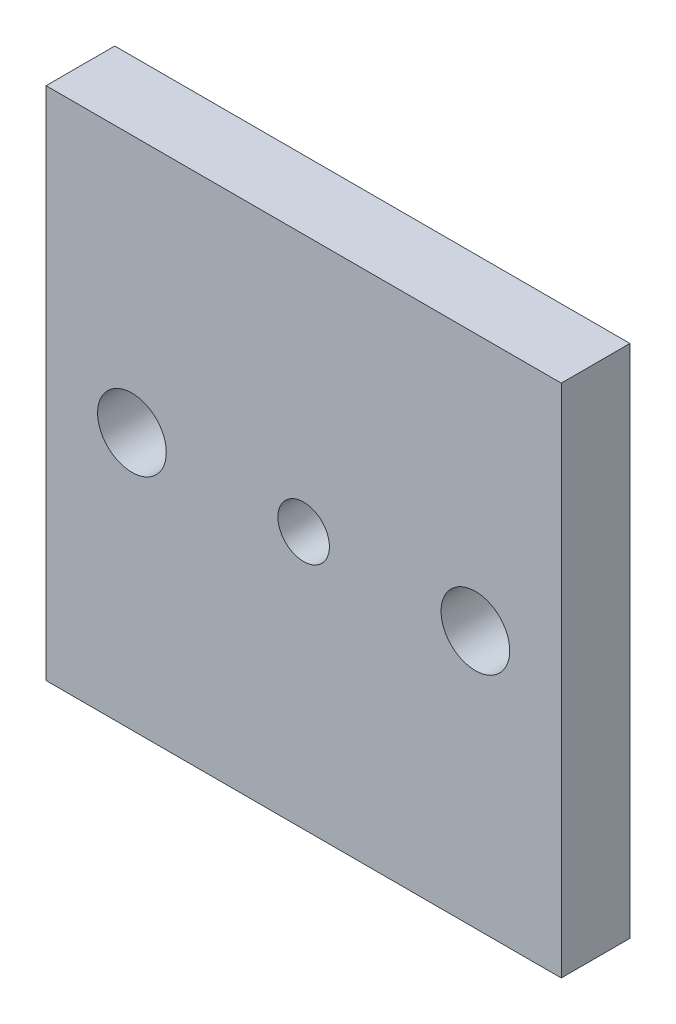
ISO-10303-21;
HEADER;
FILE_DESCRIPTION(('STEP AP214'),'2;1');
FILE_NAME('part.step','',(''),(''),'','','');
FILE_SCHEMA(('AUTOMOTIVE_DESIGN { 1 0 10303 214 1 1 1 1 }'));
ENDSEC;
DATA;
#1=APPLICATION_CONTEXT('core data for automotive mechanical design processes');
#2=APPLICATION_PROTOCOL_DEFINITION('international standard','automotive_design',2000,#1);
#3=PRODUCT_CONTEXT('',#1,'mechanical');
#4=PRODUCT('Part','Part','',(#3));
#5=PRODUCT_RELATED_PRODUCT_CATEGORY('part','',(#4));
#6=PRODUCT_DEFINITION_FORMATION('','',#4);
#7=PRODUCT_DEFINITION_CONTEXT('part definition',#1,'design');
#8=PRODUCT_DEFINITION('design','',#6,#7);
#9=PRODUCT_DEFINITION_SHAPE('','',#8);
#10=(LENGTH_UNIT() NAMED_UNIT(*) SI_UNIT(.MILLI.,.METRE.));
#11=(NAMED_UNIT(*) PLANE_ANGLE_UNIT() SI_UNIT($,.RADIAN.));
#12=(NAMED_UNIT(*) SI_UNIT($,.STERADIAN.) SOLID_ANGLE_UNIT());
#13=UNCERTAINTY_MEASURE_WITH_UNIT(LENGTH_MEASURE(1.E-05),#10,'distance_accuracy_value','');
#14=(GEOMETRIC_REPRESENTATION_CONTEXT(3) GLOBAL_UNCERTAINTY_ASSIGNED_CONTEXT((#13)) GLOBAL_UNIT_ASSIGNED_CONTEXT((#10,
#11,#12)) REPRESENTATION_CONTEXT('',''));
#15=CARTESIAN_POINT('',(0.,0.,0.));
#16=DIRECTION('',(0.,0.,1.));
#17=DIRECTION('',(1.,0.,0.));
#18=AXIS2_PLACEMENT_3D('',#15,#16,#17);
#19=CARTESIAN_POINT('',(0.,0.,4.));
#20=DIRECTION('',(1.,0.,0.));
#21=DIRECTION('',(0.,1.,0.));
#22=AXIS2_PLACEMENT_3D('',#19,#20,#21);
#23=PLANE('',#22);
#24=DIRECTION('',(0.,-1.,0.));
#25=VECTOR('',#24,1.);
#26=CARTESIAN_POINT('',(0.,0.,0.));
#27=LINE('',#26,#25);
#28=CARTESIAN_POINT('',(0.,0.,0.));
#29=VERTEX_POINT('',#28);
#30=CARTESIAN_POINT('',(0.,-30.,0.));
#31=VERTEX_POINT('',#30);
#32=EDGE_CURVE('E112',#29,#31,#27,.T.);
#33=ORIENTED_EDGE('',*,*,#32,.T.);
#34=DIRECTION('',(0.,0.,-1.));
#35=VECTOR('',#34,1.);
#36=CARTESIAN_POINT('',(0.,-30.,4.));
#37=LINE('',#36,#35);
#38=CARTESIAN_POINT('',(0.,-30.,4.));
#39=VERTEX_POINT('',#38);
#40=EDGE_CURVE('E11',#39,#31,#37,.T.);
#41=ORIENTED_EDGE('',*,*,#40,.F.);
#42=DIRECTION('',(0.,-1.,0.));
#43=VECTOR('',#42,1.);
#44=CARTESIAN_POINT('',(0.,0.,4.));
#45=LINE('',#44,#43);
#46=CARTESIAN_POINT('',(0.,0.,4.));
#47=VERTEX_POINT('',#46);
#48=EDGE_CURVE('E89',#47,#39,#45,.T.);
#49=ORIENTED_EDGE('',*,*,#48,.F.);
#50=DIRECTION('',(0.,0.,-1.));
#51=VECTOR('',#50,1.);
#52=CARTESIAN_POINT('',(0.,0.,4.));
#53=LINE('',#52,#51);
#54=EDGE_CURVE('E56',#47,#29,#53,.T.);
#55=ORIENTED_EDGE('',*,*,#54,.T.);
#56=EDGE_LOOP('',(#33,#41,#49,#55));
#57=FACE_BOUND('',#56,.T.);
#58=ADVANCED_FACE('F39',(#57),#23,.F.);
#59=CARTESIAN_POINT('',(0.,-30.,4.));
#60=DIRECTION('',(0.,1.,0.));
#61=DIRECTION('',(0.,0.,1.));
#62=AXIS2_PLACEMENT_3D('',#59,#60,#61);
#63=PLANE('',#62);
#64=DIRECTION('',(1.,0.,0.));
#65=VECTOR('',#64,1.);
#66=CARTESIAN_POINT('',(0.,-30.,0.));
#67=LINE('',#66,#65);
#68=CARTESIAN_POINT('',(30.,-30.,0.));
#69=VERTEX_POINT('',#68);
#70=EDGE_CURVE('E94',#31,#69,#67,.T.);
#71=ORIENTED_EDGE('',*,*,#70,.T.);
#72=DIRECTION('',(0.,0.,-1.));
#73=VECTOR('',#72,1.);
#74=CARTESIAN_POINT('',(30.,-30.,4.));
#75=LINE('',#74,#73);
#76=CARTESIAN_POINT('',(30.,-30.,4.));
#77=VERTEX_POINT('',#76);
#78=EDGE_CURVE('E48',#77,#69,#75,.T.);
#79=ORIENTED_EDGE('',*,*,#78,.F.);
#80=DIRECTION('',(1.,0.,0.));
#81=VECTOR('',#80,1.);
#82=CARTESIAN_POINT('',(0.,-30.,4.));
#83=LINE('',#82,#81);
#84=EDGE_CURVE('E81',#39,#77,#83,.T.);
#85=ORIENTED_EDGE('',*,*,#84,.F.);
#86=ORIENTED_EDGE('',*,*,#40,.T.);
#87=EDGE_LOOP('',(#71,#79,#85,#86));
#88=FACE_BOUND('',#87,.T.);
#89=ADVANCED_FACE('F93',(#88),#63,.F.);
#90=CARTESIAN_POINT('',(30.,0.,4.));
#91=DIRECTION('',(1.,0.,0.));
#92=DIRECTION('',(0.,0.,-1.));
#93=AXIS2_PLACEMENT_3D('',#90,#91,#92);
#94=PLANE('',#93);
#95=DIRECTION('',(0.,-1.,0.));
#96=VECTOR('',#95,1.);
#97=CARTESIAN_POINT('',(30.,0.,0.));
#98=LINE('',#97,#96);
#99=CARTESIAN_POINT('',(30.,0.,0.));
#100=VERTEX_POINT('',#99);
#101=EDGE_CURVE('E115',#100,#69,#98,.T.);
#102=ORIENTED_EDGE('',*,*,#101,.F.);
#103=DIRECTION('',(0.,0.,-1.));
#104=VECTOR('',#103,1.);
#105=CARTESIAN_POINT('',(30.,0.,4.));
#106=LINE('',#105,#104);
#107=CARTESIAN_POINT('',(30.,0.,4.));
#108=VERTEX_POINT('',#107);
#109=EDGE_CURVE('E70',#108,#100,#106,.T.);
#110=ORIENTED_EDGE('',*,*,#109,.F.);
#111=DIRECTION('',(0.,-1.,0.));
#112=VECTOR('',#111,1.);
#113=CARTESIAN_POINT('',(30.,0.,4.));
#114=LINE('',#113,#112);
#115=EDGE_CURVE('E88',#108,#77,#114,.T.);
#116=ORIENTED_EDGE('',*,*,#115,.T.);
#117=ORIENTED_EDGE('',*,*,#78,.T.);
#118=EDGE_LOOP('',(#102,#110,#116,#117));
#119=FACE_BOUND('',#118,.T.);
#120=ADVANCED_FACE('F97',(#119),#94,.T.);
#121=CARTESIAN_POINT('',(25.,-15.,4.));
#122=DIRECTION('',(0.,0.,-1.));
#123=DIRECTION('',(-1.,0.,0.));
#124=AXIS2_PLACEMENT_3D('',#121,#122,#123);
#125=CYLINDRICAL_SURFACE('',#124,2.);
#126=CARTESIAN_POINT('',(25.,-15.,4.));
#127=DIRECTION('',(0.,0.,1.));
#128=DIRECTION('',(1.,0.,0.));
#129=AXIS2_PLACEMENT_3D('',#126,#127,#128);
#130=CIRCLE('',#129,2.);
#131=CARTESIAN_POINT('',(27.,-15.,4.));
#132=VERTEX_POINT('',#131);
#133=EDGE_CURVE('E129',#132,#132,#130,.T.);
#134=ORIENTED_EDGE('',*,*,#133,.T.);
#135=EDGE_LOOP('',(#134));
#136=FACE_BOUND('',#135,.T.);
#137=CARTESIAN_POINT('',(25.,-15.,0.));
#138=DIRECTION('',(0.,0.,1.));
#139=DIRECTION('',(1.,0.,0.));
#140=AXIS2_PLACEMENT_3D('',#137,#138,#139);
#141=CIRCLE('',#140,2.);
#142=CARTESIAN_POINT('',(27.,-15.,0.));
#143=VERTEX_POINT('',#142);
#144=EDGE_CURVE('E109',#143,#143,#141,.T.);
#145=ORIENTED_EDGE('',*,*,#144,.F.);
#146=EDGE_LOOP('',(#145));
#147=FACE_BOUND('',#146,.T.);
#148=ADVANCED_FACE('F135',(#136,#147),#125,.F.);
#149=CARTESIAN_POINT('',(15.,-15.,4.));
#150=DIRECTION('',(0.,0.,-1.));
#151=DIRECTION('',(-1.,0.,0.));
#152=AXIS2_PLACEMENT_3D('',#149,#150,#151);
#153=CYLINDRICAL_SURFACE('',#152,1.5);
#154=CARTESIAN_POINT('',(15.,-15.,4.));
#155=DIRECTION('',(0.,0.,1.));
#156=DIRECTION('',(1.,0.,0.));
#157=AXIS2_PLACEMENT_3D('',#154,#155,#156);
#158=CIRCLE('',#157,1.5);
#159=CARTESIAN_POINT('',(16.5,-15.,4.));
#160=VERTEX_POINT('',#159);
#161=EDGE_CURVE('E124',#160,#160,#158,.T.);
#162=ORIENTED_EDGE('',*,*,#161,.T.);
#163=EDGE_LOOP('',(#162));
#164=FACE_BOUND('',#163,.T.);
#165=CARTESIAN_POINT('',(15.,-15.,0.));
#166=DIRECTION('',(0.,0.,1.));
#167=DIRECTION('',(1.,0.,0.));
#168=AXIS2_PLACEMENT_3D('',#165,#166,#167);
#169=CIRCLE('',#168,1.5);
#170=CARTESIAN_POINT('',(16.5,-15.,0.));
#171=VERTEX_POINT('',#170);
#172=EDGE_CURVE('E106',#171,#171,#169,.T.);
#173=ORIENTED_EDGE('',*,*,#172,.F.);
#174=EDGE_LOOP('',(#173));
#175=FACE_BOUND('',#174,.T.);
#176=ADVANCED_FACE('F160',(#164,#175),#153,.F.);
#177=CARTESIAN_POINT('',(4.99999999999999,-15.,4.));
#178=DIRECTION('',(0.,0.,-1.));
#179=DIRECTION('',(-1.,0.,0.));
#180=AXIS2_PLACEMENT_3D('',#177,#178,#179);
#181=CYLINDRICAL_SURFACE('',#180,2.);
#182=CARTESIAN_POINT('',(4.99999999999999,-15.,4.));
#183=DIRECTION('',(0.,0.,1.));
#184=DIRECTION('',(1.,0.,0.));
#185=AXIS2_PLACEMENT_3D('',#182,#183,#184);
#186=CIRCLE('',#185,2.);
#187=CARTESIAN_POINT('',(6.99999999999999,-15.,4.));
#188=VERTEX_POINT('',#187);
#189=EDGE_CURVE('E120',#188,#188,#186,.T.);
#190=ORIENTED_EDGE('',*,*,#189,.T.);
#191=EDGE_LOOP('',(#190));
#192=FACE_BOUND('',#191,.T.);
#193=CARTESIAN_POINT('',(4.99999999999999,-15.,0.));
#194=DIRECTION('',(0.,0.,1.));
#195=DIRECTION('',(1.,0.,0.));
#196=AXIS2_PLACEMENT_3D('',#193,#194,#195);
#197=CIRCLE('',#196,2.);
#198=CARTESIAN_POINT('',(6.99999999999999,-15.,0.));
#199=VERTEX_POINT('',#198);
#200=EDGE_CURVE('E103',#199,#199,#197,.T.);
#201=ORIENTED_EDGE('',*,*,#200,.F.);
#202=EDGE_LOOP('',(#201));
#203=FACE_BOUND('',#202,.T.);
#204=ADVANCED_FACE('F41',(#192,#203),#181,.F.);
#205=CARTESIAN_POINT('',(0.,0.,4.));
#206=DIRECTION('',(0.,1.,0.));
#207=DIRECTION('',(0.,0.,1.));
#208=AXIS2_PLACEMENT_3D('',#205,#206,#207);
#209=PLANE('',#208);
#210=DIRECTION('',(1.,0.,0.));
#211=VECTOR('',#210,1.);
#212=CARTESIAN_POINT('',(0.,0.,0.));
#213=LINE('',#212,#211);
#214=EDGE_CURVE('E117',#29,#100,#213,.T.);
#215=ORIENTED_EDGE('',*,*,#214,.F.);
#216=ORIENTED_EDGE('',*,*,#54,.F.);
#217=DIRECTION('',(1.,0.,0.));
#218=VECTOR('',#217,1.);
#219=CARTESIAN_POINT('',(0.,0.,4.));
#220=LINE('',#219,#218);
#221=EDGE_CURVE('E98',#47,#108,#220,.T.);
#222=ORIENTED_EDGE('',*,*,#221,.T.);
#223=ORIENTED_EDGE('',*,*,#109,.T.);
#224=EDGE_LOOP('',(#215,#216,#222,#223));
#225=FACE_BOUND('',#224,.T.);
#226=ADVANCED_FACE('F140',(#225),#209,.T.);
#227=CARTESIAN_POINT('',(0.,0.,4.));
#228=DIRECTION('',(0.,0.,1.));
#229=DIRECTION('',(1.,0.,0.));
#230=AXIS2_PLACEMENT_3D('',#227,#228,#229);
#231=PLANE('',#230);
#232=ORIENTED_EDGE('',*,*,#189,.F.);
#233=EDGE_LOOP('',(#232));
#234=FACE_BOUND('',#233,.T.);
#235=ORIENTED_EDGE('',*,*,#161,.F.);
#236=EDGE_LOOP('',(#235));
#237=FACE_BOUND('',#236,.T.);
#238=ORIENTED_EDGE('',*,*,#133,.F.);
#239=EDGE_LOOP('',(#238));
#240=FACE_BOUND('',#239,.T.);
#241=ORIENTED_EDGE('',*,*,#48,.T.);
#242=ORIENTED_EDGE('',*,*,#84,.T.);
#243=ORIENTED_EDGE('',*,*,#115,.F.);
#244=ORIENTED_EDGE('',*,*,#221,.F.);
#245=EDGE_LOOP('',(#241,#242,#243,#244));
#246=FACE_BOUND('',#245,.T.);
#247=ADVANCED_FACE('F85',(#234,#237,#240,#246),#231,.T.);
#248=CARTESIAN_POINT('',(0.,0.,0.));
#249=DIRECTION('',(0.,0.,1.));
#250=DIRECTION('',(1.,0.,0.));
#251=AXIS2_PLACEMENT_3D('',#248,#249,#250);
#252=PLANE('',#251);
#253=ORIENTED_EDGE('',*,*,#200,.T.);
#254=EDGE_LOOP('',(#253));
#255=FACE_BOUND('',#254,.T.);
#256=ORIENTED_EDGE('',*,*,#172,.T.);
#257=EDGE_LOOP('',(#256));
#258=FACE_BOUND('',#257,.T.);
#259=ORIENTED_EDGE('',*,*,#144,.T.);
#260=EDGE_LOOP('',(#259));
#261=FACE_BOUND('',#260,.T.);
#262=ORIENTED_EDGE('',*,*,#32,.F.);
#263=ORIENTED_EDGE('',*,*,#214,.T.);
#264=ORIENTED_EDGE('',*,*,#101,.T.);
#265=ORIENTED_EDGE('',*,*,#70,.F.);
#266=EDGE_LOOP('',(#262,#263,#264,#265));
#267=FACE_BOUND('',#266,.T.);
#268=ADVANCED_FACE('F139',(#255,#258,#261,#267),#252,.F.);
#269=CLOSED_SHELL('',(#58,#89,#120,#148,#176,#204,#226,#247,#268));
#270=MANIFOLD_SOLID_BREP('B2',#269);
#271=ADVANCED_BREP_SHAPE_REPRESENTATION('',(#18,#270),#14);
#272=SHAPE_DEFINITION_REPRESENTATION(#9,#271);
ENDSEC;
END-ISO-10303-21;
